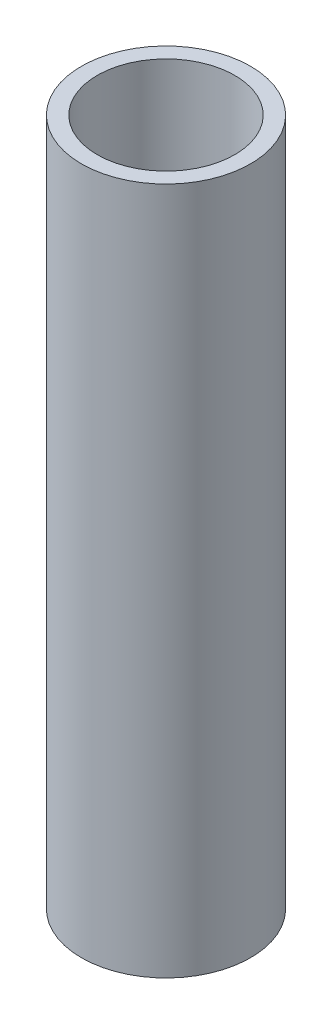
ISO-10303-21;
HEADER;
FILE_DESCRIPTION(('STEP AP214'),'2;1');
FILE_NAME('part.step','',(''),(''),'','','');
FILE_SCHEMA(('AUTOMOTIVE_DESIGN { 1 0 10303 214 1 1 1 1 }'));
ENDSEC;
DATA;
#1=APPLICATION_CONTEXT('core data for automotive mechanical design processes');
#2=APPLICATION_PROTOCOL_DEFINITION('international standard','automotive_design',2000,#1);
#3=PRODUCT_CONTEXT('',#1,'mechanical');
#4=PRODUCT('Part','Part','',(#3));
#5=PRODUCT_RELATED_PRODUCT_CATEGORY('part','',(#4));
#6=PRODUCT_DEFINITION_FORMATION('','',#4);
#7=PRODUCT_DEFINITION_CONTEXT('part definition',#1,'design');
#8=PRODUCT_DEFINITION('design','',#6,#7);
#9=PRODUCT_DEFINITION_SHAPE('','',#8);
#10=(LENGTH_UNIT() NAMED_UNIT(*) SI_UNIT(.MILLI.,.METRE.));
#11=(NAMED_UNIT(*) PLANE_ANGLE_UNIT() SI_UNIT($,.RADIAN.));
#12=(NAMED_UNIT(*) SI_UNIT($,.STERADIAN.) SOLID_ANGLE_UNIT());
#13=UNCERTAINTY_MEASURE_WITH_UNIT(LENGTH_MEASURE(1.E-05),#10,'distance_accuracy_value','');
#14=(GEOMETRIC_REPRESENTATION_CONTEXT(3) GLOBAL_UNCERTAINTY_ASSIGNED_CONTEXT((#13)) GLOBAL_UNIT_ASSIGNED_CONTEXT((#10,
#11,#12)) REPRESENTATION_CONTEXT('',''));
#15=CARTESIAN_POINT('',(0.,0.,0.));
#16=DIRECTION('',(0.,0.,1.));
#17=DIRECTION('',(1.,0.,0.));
#18=AXIS2_PLACEMENT_3D('',#15,#16,#17);
#19=CARTESIAN_POINT('',(0.,25.,0.));
#20=DIRECTION('',(0.,1.,0.));
#21=DIRECTION('',(0.,0.,1.));
#22=AXIS2_PLACEMENT_3D('',#19,#20,#21);
#23=PLANE('',#22);
#24=CARTESIAN_POINT('',(0.,25.,0.));
#25=DIRECTION('',(0.,1.,0.));
#26=DIRECTION('',(0.,0.,1.));
#27=AXIS2_PLACEMENT_3D('',#24,#25,#26);
#28=CIRCLE('',#27,3.075);
#29=CARTESIAN_POINT('',(0.,25.,3.075));
#30=VERTEX_POINT('',#29);
#31=EDGE_CURVE('E10',#30,#30,#28,.T.);
#32=ORIENTED_EDGE('',*,*,#31,.T.);
#33=EDGE_LOOP('',(#32));
#34=FACE_BOUND('',#33,.T.);
#35=CARTESIAN_POINT('',(0.,25.,0.));
#36=DIRECTION('',(0.,1.,0.));
#37=DIRECTION('',(0.,0.,1.));
#38=AXIS2_PLACEMENT_3D('',#35,#36,#37);
#39=CIRCLE('',#38,2.5);
#40=CARTESIAN_POINT('',(0.,25.,2.5));
#41=VERTEX_POINT('',#40);
#42=EDGE_CURVE('E46',#41,#41,#39,.T.);
#43=ORIENTED_EDGE('',*,*,#42,.F.);
#44=EDGE_LOOP('',(#43));
#45=FACE_BOUND('',#44,.T.);
#46=ADVANCED_FACE('F35',(#34,#45),#23,.T.);
#47=CARTESIAN_POINT('',(0.,0.,0.));
#48=DIRECTION('',(0.,1.,0.));
#49=DIRECTION('',(0.,0.,1.));
#50=AXIS2_PLACEMENT_3D('',#47,#48,#49);
#51=PLANE('',#50);
#52=CARTESIAN_POINT('',(0.,0.,0.));
#53=DIRECTION('',(0.,1.,0.));
#54=DIRECTION('',(0.,0.,1.));
#55=AXIS2_PLACEMENT_3D('',#52,#53,#54);
#56=CIRCLE('',#55,3.075);
#57=CARTESIAN_POINT('',(0.,0.,3.075));
#58=VERTEX_POINT('',#57);
#59=EDGE_CURVE('E39',#58,#58,#56,.T.);
#60=ORIENTED_EDGE('',*,*,#59,.F.);
#61=EDGE_LOOP('',(#60));
#62=FACE_BOUND('',#61,.T.);
#63=CARTESIAN_POINT('',(0.,0.,0.));
#64=DIRECTION('',(0.,1.,0.));
#65=DIRECTION('',(0.,0.,1.));
#66=AXIS2_PLACEMENT_3D('',#63,#64,#65);
#67=CIRCLE('',#66,2.5);
#68=CARTESIAN_POINT('',(0.,0.,2.5));
#69=VERTEX_POINT('',#68);
#70=EDGE_CURVE('E48',#69,#69,#67,.T.);
#71=ORIENTED_EDGE('',*,*,#70,.T.);
#72=EDGE_LOOP('',(#71));
#73=FACE_BOUND('',#72,.T.);
#74=ADVANCED_FACE('F58',(#62,#73),#51,.F.);
#75=CARTESIAN_POINT('',(0.,25.,0.));
#76=DIRECTION('',(0.,-1.,0.));
#77=DIRECTION('',(0.,0.,-1.));
#78=AXIS2_PLACEMENT_3D('',#75,#76,#77);
#79=CYLINDRICAL_SURFACE('',#78,3.075);
#80=ORIENTED_EDGE('',*,*,#31,.F.);
#81=EDGE_LOOP('',(#80));
#82=FACE_BOUND('',#81,.T.);
#83=ORIENTED_EDGE('',*,*,#59,.T.);
#84=EDGE_LOOP('',(#83));
#85=FACE_BOUND('',#84,.T.);
#86=ADVANCED_FACE('F37',(#82,#85),#79,.T.);
#87=CARTESIAN_POINT('',(0.,25.,0.));
#88=DIRECTION('',(0.,-1.,0.));
#89=DIRECTION('',(0.,0.,-1.));
#90=AXIS2_PLACEMENT_3D('',#87,#88,#89);
#91=CYLINDRICAL_SURFACE('',#90,2.5);
#92=ORIENTED_EDGE('',*,*,#42,.T.);
#93=EDGE_LOOP('',(#92));
#94=FACE_BOUND('',#93,.T.);
#95=ORIENTED_EDGE('',*,*,#70,.F.);
#96=EDGE_LOOP('',(#95));
#97=FACE_BOUND('',#96,.T.);
#98=ADVANCED_FACE('F54',(#94,#97),#91,.F.);
#99=CLOSED_SHELL('',(#46,#74,#86,#98));
#100=MANIFOLD_SOLID_BREP('B2',#99);
#101=ADVANCED_BREP_SHAPE_REPRESENTATION('',(#18,#100),#14);
#102=SHAPE_DEFINITION_REPRESENTATION(#9,#101);
ENDSEC;
END-ISO-10303-21;
